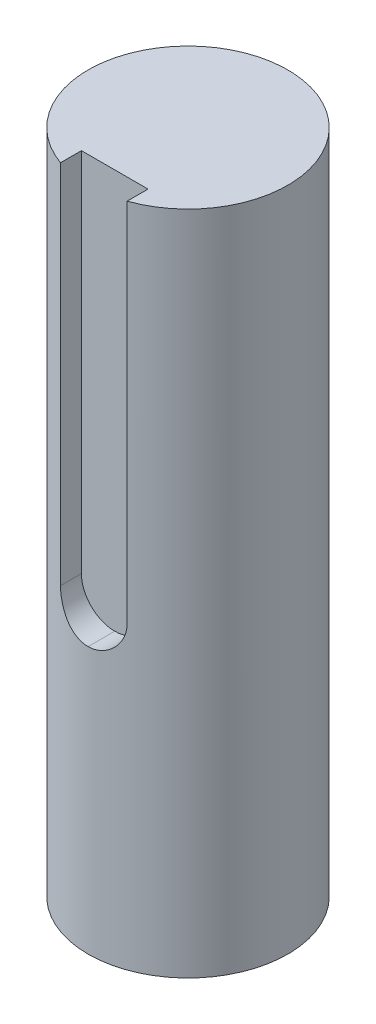
ISO-10303-21;
HEADER;
FILE_DESCRIPTION(('STEP AP214'),'2;1');
FILE_NAME('part.step','',(''),(''),'','','');
FILE_SCHEMA(('AUTOMOTIVE_DESIGN { 1 0 10303 214 1 1 1 1 }'));
ENDSEC;
DATA;
#1=APPLICATION_CONTEXT('core data for automotive mechanical design processes');
#2=APPLICATION_PROTOCOL_DEFINITION('international standard','automotive_design',2000,#1);
#3=PRODUCT_CONTEXT('',#1,'mechanical');
#4=PRODUCT('Part','Part','',(#3));
#5=PRODUCT_RELATED_PRODUCT_CATEGORY('part','',(#4));
#6=PRODUCT_DEFINITION_FORMATION('','',#4);
#7=PRODUCT_DEFINITION_CONTEXT('part definition',#1,'design');
#8=PRODUCT_DEFINITION('design','',#6,#7);
#9=PRODUCT_DEFINITION_SHAPE('','',#8);
#10=(LENGTH_UNIT() NAMED_UNIT(*) SI_UNIT(.MILLI.,.METRE.));
#11=(NAMED_UNIT(*) PLANE_ANGLE_UNIT() SI_UNIT($,.RADIAN.));
#12=(NAMED_UNIT(*) SI_UNIT($,.STERADIAN.) SOLID_ANGLE_UNIT());
#13=UNCERTAINTY_MEASURE_WITH_UNIT(LENGTH_MEASURE(1.E-05),#10,'distance_accuracy_value','');
#14=(GEOMETRIC_REPRESENTATION_CONTEXT(3) GLOBAL_UNCERTAINTY_ASSIGNED_CONTEXT((#13)) GLOBAL_UNIT_ASSIGNED_CONTEXT((#10,
#11,#12)) REPRESENTATION_CONTEXT('',''));
#15=CARTESIAN_POINT('',(0.,0.,0.));
#16=DIRECTION('',(0.,0.,1.));
#17=DIRECTION('',(1.,0.,0.));
#18=AXIS2_PLACEMENT_3D('',#15,#16,#17);
#19=CARTESIAN_POINT('',(0.,50.,0.));
#20=DIRECTION('',(0.,-1.,0.));
#21=DIRECTION('',(0.,0.,-1.));
#22=AXIS2_PLACEMENT_3D('',#19,#20,#21);
#23=CYLINDRICAL_SURFACE('',#22,15.);
#24=CARTESIAN_POINT('',(5.,-4.99999999999999,14.142135623731));
#25=CARTESIAN_POINT('',(5.00001930140143,-5.13641672063141,14.142113273131));
#26=CARTESIAN_POINT('',(4.99441800101494,-5.27282479219739,14.1441087254676));
#27=CARTESIAN_POINT('',(4.97211825524553,-5.54458274520501,14.1519714816942));
#28=CARTESIAN_POINT('',(4.95542280692864,-5.67993290245185,14.1578377398894));
#29=CARTESIAN_POINT('',(4.91114573420536,-5.94820262810353,14.1732551693247));
#30=CARTESIAN_POINT('',(4.8835971846055,-6.08112830923212,14.1827951429519));
#31=CARTESIAN_POINT('',(4.81787628536932,-6.34403405881968,14.2052553805913));
#32=CARTESIAN_POINT('',(4.77970355246154,-6.47401402082773,14.2181757665521));
#33=CARTESIAN_POINT('',(4.69309599348037,-6.73005663702843,14.2469971429779));
#34=CARTESIAN_POINT('',(4.64466926619614,-6.8561222932335,14.2628957800306));
#35=CARTESIAN_POINT('',(4.53792949429829,-7.10366053156548,14.2972141637568));
#36=CARTESIAN_POINT('',(4.47961277307173,-7.22513138495668,14.3156348475107));
#37=CARTESIAN_POINT('',(4.29043552398853,-7.58155645611047,14.3739216366399));
#38=CARTESIAN_POINT('',(4.14531408345069,-7.80862253966398,14.4168242933955));
#39=CARTESIAN_POINT('',(3.8152114938415,-8.24365987792856,14.5077337347384));
#40=CARTESIAN_POINT('',(3.62900486439452,-8.45067500953367,14.5558671830847));
#41=CARTESIAN_POINT('',(3.32596187179199,-8.73594685412703,14.6269888422811));
#42=CARTESIAN_POINT('',(3.22092035968557,-8.82687696900627,14.6505304075563));
#43=CARTESIAN_POINT('',(3.00351663448969,-8.99976880817722,14.6966395432177));
#44=CARTESIAN_POINT('',(2.89115697848813,-9.08173363855816,14.719207449284));
#45=CARTESIAN_POINT('',(2.65667798628051,-9.23821476588634,14.7633558256));
#46=CARTESIAN_POINT('',(2.53437750477635,-9.31247165950663,14.7848934541064));
#47=CARTESIAN_POINT('',(2.28361514222635,-9.45034448925153,14.8256949705958));
#48=CARTESIAN_POINT('',(2.1551556393351,-9.51396449064437,14.8449597264059));
#49=CARTESIAN_POINT('',(1.89298215590879,-9.63002700141542,14.8806618888127));
#50=CARTESIAN_POINT('',(1.75927126099023,-9.68247596166308,14.8971009260947));
#51=CARTESIAN_POINT('',(1.48756419413722,-9.7757511194894,14.9266825279628));
#52=CARTESIAN_POINT('',(1.3495691048552,-9.81658022741086,14.9398259178883));
#53=CARTESIAN_POINT('',(1.01267472914876,-9.90058356008655,14.9670805764488));
#54=CARTESIAN_POINT('',(0.812085287262651,-9.93780620629757,14.9793636106289));
#55=CARTESIAN_POINT('',(0.50884229874517,-9.9750867922293,14.9917101800979));
#56=CARTESIAN_POINT('',(0.407350687551492,-9.9844214324306,14.9948127167519));
#57=CARTESIAN_POINT('',(0.203917686220267,-9.99687863173638,14.9989591530639));
#58=CARTESIAN_POINT('',(0.101976182242001,-9.99999951605968,15.0000024977113));
#59=CARTESIAN_POINT('',(0.,-9.99999999999999,15.));
#60=B_SPLINE_CURVE_WITH_KNOTS('',3,(#24,#25,#26,#27,#28,#29,#30,#31,#32,#33,#34,#35,#36,#37,#38,
#39,#40,#41,#42,#43,#44,#45,#46,#47,#48,#49,#50,#51,#52,#53,#54,#55,#56,#57,#58,#59),
.UNSPECIFIED.,.F.,.F.,(4,2,2,2,2,2,2,2,2,2,2,2,2,2,2,2,2,4),(0.,0.409107130686766,
0.818103786654156,1.22586354973028,1.63363802480251,2.04109162565435,2.44869703106988,
3.2635947932239,4.10723827983486,4.52957806248627,4.95177105579377,5.38531132672239,
5.8186855241121,6.25180878107508,6.68482346103591,7.29606398171757,7.60178834421382,
7.90759509683744),.UNSPECIFIED.);
#61=CARTESIAN_POINT('',(5.,-5.,14.142135623731));
#62=VERTEX_POINT('',#61);
#63=CARTESIAN_POINT('',(0.,-9.99999999999999,15.));
#64=VERTEX_POINT('',#63);
#65=EDGE_CURVE('E52',#62,#64,#60,.T.);
#66=ORIENTED_EDGE('',*,*,#65,.T.);
#67=CARTESIAN_POINT('',(0.,-9.99999999999999,15.));
#68=CARTESIAN_POINT('',(-0.1366297646804,-10.0000189248185,15.0000180994444));
#69=CARTESIAN_POINT('',(-0.273252336011465,-9.99440055029779,14.9981338853301));
#70=CARTESIAN_POINT('',(-0.545451684094969,-9.97202928951856,14.9906927638689));
#71=CARTESIAN_POINT('',(-0.681028693744674,-9.95527895987073,14.9851366998159));
#72=CARTESIAN_POINT('',(-0.949794971236428,-9.91084562059205,14.9705040726178));
#73=CARTESIAN_POINT('',(-1.08298983028303,-9.88319314052399,14.9614373417379));
#74=CARTESIAN_POINT('',(-1.34644004698235,-9.81721254539274,14.9400320280365));
#75=CARTESIAN_POINT('',(-1.47669532784749,-9.77888415180183,14.9276933598527));
#76=CARTESIAN_POINT('',(-1.73330210868002,-9.69190865887368,14.9000775333664));
#77=CARTESIAN_POINT('',(-1.85965589542804,-9.64326774078558,14.8848021358262));
#78=CARTESIAN_POINT('',(-2.10776945958221,-9.53603158198748,14.8516996096304));
#79=CARTESIAN_POINT('',(-2.22952751302998,-9.4774326502865,14.8338715351986));
#80=CARTESIAN_POINT('',(-2.46767414951522,-9.35072098114459,14.7961182815464));
#81=CARTESIAN_POINT('',(-2.58406204352679,-9.28260702735602,14.7761928342898));
#82=CARTESIAN_POINT('',(-2.81077955484082,-9.13735046330422,14.7347489356297));
#83=CARTESIAN_POINT('',(-2.92110697626473,-9.06020461182261,14.7132299133746));
#84=CARTESIAN_POINT('',(-3.24856396823725,-8.81097017550145,14.645728552953));
#85=CARTESIAN_POINT('',(-3.45494573899543,-8.62492023418647,14.5979929056678));
#86=CARTESIAN_POINT('',(-3.83420465806833,-8.22112143218247,14.5030085648523));
#87=CARTESIAN_POINT('',(-4.00707163673484,-8.00336298492911,14.4557600232331));
#88=CARTESIAN_POINT('',(-4.24005924800747,-7.65374148166438,14.3884917106557));
#89=CARTESIAN_POINT('',(-4.31420623346018,-7.53142539570404,14.3663776501525));
#90=CARTESIAN_POINT('',(-4.45187656905697,-7.28062118723106,14.324314086056));
#91=CARTESIAN_POINT('',(-4.51540397858448,-7.15213544738552,14.3043637563952));
#92=CARTESIAN_POINT('',(-4.63127398884078,-6.88992865055052,14.2672704662351));
#93=CARTESIAN_POINT('',(-4.68362423644647,-6.75621124740105,14.2501255882685));
#94=CARTESIAN_POINT('',(-4.77671067757201,-6.48447746134348,14.2191923403644));
#95=CARTESIAN_POINT('',(-4.81744985939537,-6.34646219472463,14.205403106929));
#96=CARTESIAN_POINT('',(-4.90109286102122,-6.01008713372802,14.1768129790186));
#97=CARTESIAN_POINT('',(-4.9381180415746,-5.81004807620791,14.1638882153015));
#98=CARTESIAN_POINT('',(-4.97520831729206,-5.50760065363592,14.150881511613));
#99=CARTESIAN_POINT('',(-4.98449717477756,-5.40635932331841,14.1476093297013));
#100=CARTESIAN_POINT('',(-4.99689374630787,-5.20342365147271,14.1432343352766));
#101=CARTESIAN_POINT('',(-4.99999971193514,-5.10172918995239,14.142132136399));
#102=CARTESIAN_POINT('',(-5.,-5.,14.1421356237309));
#103=B_SPLINE_CURVE_WITH_KNOTS('',3,(#67,#68,#69,#70,#71,#72,#73,#74,#75,#76,#77,#78,#79,#80,
#81,#82,#83,#84,#85,#86,#87,#88,#89,#90,#91,#92,#93,#94,#95,#96,#97,#98,#99,#100,#101,#102),
.UNSPECIFIED.,.F.,.F.,(4,2,2,2,2,2,2,2,2,2,2,2,2,2,2,2,2,4),(0.,0.409749750909139,
0.819405429507438,1.22792199561023,1.63644922064628,2.04473226635538,2.45316697576197,
2.86165394505706,3.27028795736094,4.11205533213187,4.95407773237843,5.3878267599704,
5.82140960390347,6.25469485396756,6.68786848986186,7.29750082646073,7.60248009219554,
7.90754558867848),.UNSPECIFIED.);
#104=CARTESIAN_POINT('',(-5.,-5.,14.142135623731));
#105=VERTEX_POINT('',#104);
#106=EDGE_CURVE('E11',#64,#105,#103,.T.);
#107=ORIENTED_EDGE('',*,*,#106,.T.);
#108=DIRECTION('',(0.,-1.,0.));
#109=VECTOR('',#108,1.);
#110=CARTESIAN_POINT('',(-5.,50.,14.142135623731));
#111=LINE('',#110,#109);
#112=CARTESIAN_POINT('',(-5.,50.,14.142135623731));
#113=VERTEX_POINT('',#112);
#114=EDGE_CURVE('E118',#105,#113,#111,.F.);
#115=ORIENTED_EDGE('',*,*,#114,.T.);
#116=CARTESIAN_POINT('',(0.,50.,0.));
#117=DIRECTION('',(0.,1.,0.));
#118=DIRECTION('',(0.,0.,1.));
#119=AXIS2_PLACEMENT_3D('',#116,#117,#118);
#120=CIRCLE('',#119,15.);
#121=CARTESIAN_POINT('',(5.,50.,14.142135623731));
#122=VERTEX_POINT('',#121);
#123=EDGE_CURVE('E108',#122,#113,#120,.T.);
#124=ORIENTED_EDGE('',*,*,#123,.F.);
#125=DIRECTION('',(0.,-1.,0.));
#126=VECTOR('',#125,1.);
#127=CARTESIAN_POINT('',(5.,50.,14.142135623731));
#128=LINE('',#127,#126);
#129=EDGE_CURVE('E103',#122,#62,#128,.T.);
#130=ORIENTED_EDGE('',*,*,#129,.T.);
#131=EDGE_LOOP('',(#66,#107,#115,#124,#130));
#132=FACE_BOUND('',#131,.T.);
#133=CARTESIAN_POINT('',(0.,-50.,0.));
#134=DIRECTION('',(0.,1.,0.));
#135=DIRECTION('',(0.,0.,1.));
#136=AXIS2_PLACEMENT_3D('',#133,#134,#135);
#137=CIRCLE('',#136,15.);
#138=CARTESIAN_POINT('',(0.,-50.,15.));
#139=VERTEX_POINT('',#138);
#140=EDGE_CURVE('E120',#139,#139,#137,.T.);
#141=ORIENTED_EDGE('',*,*,#140,.T.);
#142=EDGE_LOOP('',(#141));
#143=FACE_BOUND('',#142,.T.);
#144=ADVANCED_FACE('F42',(#132,#143),#23,.T.);
#145=CARTESIAN_POINT('',(0.,50.,0.));
#146=DIRECTION('',(0.,1.,0.));
#147=DIRECTION('',(0.,0.,1.));
#148=AXIS2_PLACEMENT_3D('',#145,#146,#147);
#149=PLANE('',#148);
#150=DIRECTION('',(0.,0.,1.));
#151=VECTOR('',#150,1.);
#152=CARTESIAN_POINT('',(-5.,50.,19.));
#153=LINE('',#152,#151);
#154=CARTESIAN_POINT('',(-5.,50.,11.));
#155=VERTEX_POINT('',#154);
#156=EDGE_CURVE('E112',#155,#113,#153,.T.);
#157=ORIENTED_EDGE('',*,*,#156,.F.);
#158=DIRECTION('',(-1.,0.,0.));
#159=VECTOR('',#158,1.);
#160=CARTESIAN_POINT('',(5.,50.,11.));
#161=LINE('',#160,#159);
#162=CARTESIAN_POINT('',(5.,50.,11.));
#163=VERTEX_POINT('',#162);
#164=EDGE_CURVE('E91',#163,#155,#161,.T.);
#165=ORIENTED_EDGE('',*,*,#164,.F.);
#166=DIRECTION('',(0.,0.,-1.));
#167=VECTOR('',#166,1.);
#168=CARTESIAN_POINT('',(5.,50.,0.));
#169=LINE('',#168,#167);
#170=EDGE_CURVE('E101',#122,#163,#169,.T.);
#171=ORIENTED_EDGE('',*,*,#170,.F.);
#172=ORIENTED_EDGE('',*,*,#123,.T.);
#173=EDGE_LOOP('',(#157,#165,#171,#172));
#174=FACE_BOUND('',#173,.T.);
#175=ADVANCED_FACE('F110',(#174),#149,.T.);
#176=CARTESIAN_POINT('',(0.,-50.,0.));
#177=DIRECTION('',(0.,1.,0.));
#178=DIRECTION('',(0.,0.,1.));
#179=AXIS2_PLACEMENT_3D('',#176,#177,#178);
#180=PLANE('',#179);
#181=ORIENTED_EDGE('',*,*,#140,.F.);
#182=EDGE_LOOP('',(#181));
#183=FACE_BOUND('',#182,.T.);
#184=ADVANCED_FACE('F154',(#183),#180,.F.);
#185=CARTESIAN_POINT('',(-5.,-9.99999999999999,19.));
#186=DIRECTION('',(-1.,0.,0.));
#187=DIRECTION('',(0.,0.,1.));
#188=AXIS2_PLACEMENT_3D('',#185,#186,#187);
#189=PLANE('',#188);
#190=ORIENTED_EDGE('',*,*,#114,.F.);
#191=DIRECTION('',(0.,0.,1.));
#192=VECTOR('',#191,1.);
#193=CARTESIAN_POINT('',(-5.,-4.99999999999999,19.));
#194=LINE('',#193,#192);
#195=CARTESIAN_POINT('',(-5.,-4.99999999999999,11.));
#196=VERTEX_POINT('',#195);
#197=EDGE_CURVE('E128',#105,#196,#194,.F.);
#198=ORIENTED_EDGE('',*,*,#197,.T.);
#199=DIRECTION('',(0.,1.,0.));
#200=VECTOR('',#199,1.);
#201=CARTESIAN_POINT('',(-5.,-9.99999999999999,11.));
#202=LINE('',#201,#200);
#203=EDGE_CURVE('E98',#196,#155,#202,.T.);
#204=ORIENTED_EDGE('',*,*,#203,.T.);
#205=ORIENTED_EDGE('',*,*,#156,.T.);
#206=EDGE_LOOP('',(#190,#198,#204,#205));
#207=FACE_BOUND('',#206,.T.);
#208=ADVANCED_FACE('F160',(#207),#189,.F.);
#209=CARTESIAN_POINT('',(5.,-9.99999999999999,19.));
#210=DIRECTION('',(1.,0.,0.));
#211=DIRECTION('',(0.,0.,-1.));
#212=AXIS2_PLACEMENT_3D('',#209,#210,#211);
#213=PLANE('',#212);
#214=DIRECTION('',(0.,1.,0.));
#215=VECTOR('',#214,1.);
#216=CARTESIAN_POINT('',(5.,-9.99999999999999,11.));
#217=LINE('',#216,#215);
#218=CARTESIAN_POINT('',(5.,-4.99999999999999,11.));
#219=VERTEX_POINT('',#218);
#220=EDGE_CURVE('E86',#219,#163,#217,.T.);
#221=ORIENTED_EDGE('',*,*,#220,.F.);
#222=DIRECTION('',(0.,0.,-1.));
#223=VECTOR('',#222,1.);
#224=CARTESIAN_POINT('',(5.,-4.99999999999999,19.));
#225=LINE('',#224,#223);
#226=EDGE_CURVE('E126',#219,#62,#225,.F.);
#227=ORIENTED_EDGE('',*,*,#226,.T.);
#228=ORIENTED_EDGE('',*,*,#129,.F.);
#229=ORIENTED_EDGE('',*,*,#170,.T.);
#230=EDGE_LOOP('',(#221,#227,#228,#229));
#231=FACE_BOUND('',#230,.T.);
#232=ADVANCED_FACE('F102',(#231),#213,.F.);
#233=CARTESIAN_POINT('',(5.,-9.99999999999999,11.));
#234=DIRECTION('',(0.,0.,-1.));
#235=DIRECTION('',(-1.,0.,0.));
#236=AXIS2_PLACEMENT_3D('',#233,#234,#235);
#237=PLANE('',#236);
#238=CARTESIAN_POINT('',(0.,-4.99999999999999,11.));
#239=DIRECTION('',(0.,0.,-1.));
#240=DIRECTION('',(-1.,0.,0.));
#241=AXIS2_PLACEMENT_3D('',#238,#239,#240);
#242=CIRCLE('',#241,5.);
#243=CARTESIAN_POINT('',(0.,-9.99999999999999,11.));
#244=VERTEX_POINT('',#243);
#245=EDGE_CURVE('E107',#196,#244,#242,.F.);
#246=ORIENTED_EDGE('',*,*,#245,.T.);
#247=CARTESIAN_POINT('',(0.,-4.99999999999999,11.));
#248=DIRECTION('',(0.,0.,-1.));
#249=DIRECTION('',(-1.,0.,0.));
#250=AXIS2_PLACEMENT_3D('',#247,#248,#249);
#251=CIRCLE('',#250,5.);
#252=EDGE_CURVE('E94',#244,#219,#251,.F.);
#253=ORIENTED_EDGE('',*,*,#252,.T.);
#254=ORIENTED_EDGE('',*,*,#220,.T.);
#255=ORIENTED_EDGE('',*,*,#164,.T.);
#256=ORIENTED_EDGE('',*,*,#203,.F.);
#257=EDGE_LOOP('',(#246,#253,#254,#255,#256));
#258=FACE_BOUND('',#257,.T.);
#259=ADVANCED_FACE('F88',(#258),#237,.F.);
#260=CARTESIAN_POINT('',(0.,-4.99999999999999,0.));
#261=DIRECTION('',(0.,0.,1.));
#262=DIRECTION('',(1.,0.,0.));
#263=AXIS2_PLACEMENT_3D('',#260,#261,#262);
#264=CYLINDRICAL_SURFACE('',#263,5.);
#265=ORIENTED_EDGE('',*,*,#197,.F.);
#266=ORIENTED_EDGE('',*,*,#106,.F.);
#267=DIRECTION('',(0.,0.,1.));
#268=VECTOR('',#267,1.);
#269=CARTESIAN_POINT('',(0.,-9.99999999999999,0.));
#270=LINE('',#269,#268);
#271=EDGE_CURVE('E47',#244,#64,#270,.T.);
#272=ORIENTED_EDGE('',*,*,#271,.F.);
#273=ORIENTED_EDGE('',*,*,#245,.F.);
#274=EDGE_LOOP('',(#265,#266,#272,#273));
#275=FACE_BOUND('',#274,.T.);
#276=ADVANCED_FACE('F44',(#275),#264,.F.);
#277=CARTESIAN_POINT('',(0.,-4.99999999999999,0.));
#278=DIRECTION('',(0.,0.,-1.));
#279=DIRECTION('',(-1.,0.,0.));
#280=AXIS2_PLACEMENT_3D('',#277,#278,#279);
#281=CYLINDRICAL_SURFACE('',#280,5.);
#282=ORIENTED_EDGE('',*,*,#65,.F.);
#283=ORIENTED_EDGE('',*,*,#226,.F.);
#284=ORIENTED_EDGE('',*,*,#252,.F.);
#285=ORIENTED_EDGE('',*,*,#271,.T.);
#286=EDGE_LOOP('',(#282,#283,#284,#285));
#287=FACE_BOUND('',#286,.T.);
#288=ADVANCED_FACE('F141',(#287),#281,.F.);
#289=CLOSED_SHELL('',(#144,#175,#184,#208,#232,#259,#276,#288));
#290=MANIFOLD_SOLID_BREP('B2',#289);
#291=ADVANCED_BREP_SHAPE_REPRESENTATION('',(#18,#290),#14);
#292=SHAPE_DEFINITION_REPRESENTATION(#9,#291);
ENDSEC;
END-ISO-10303-21;
